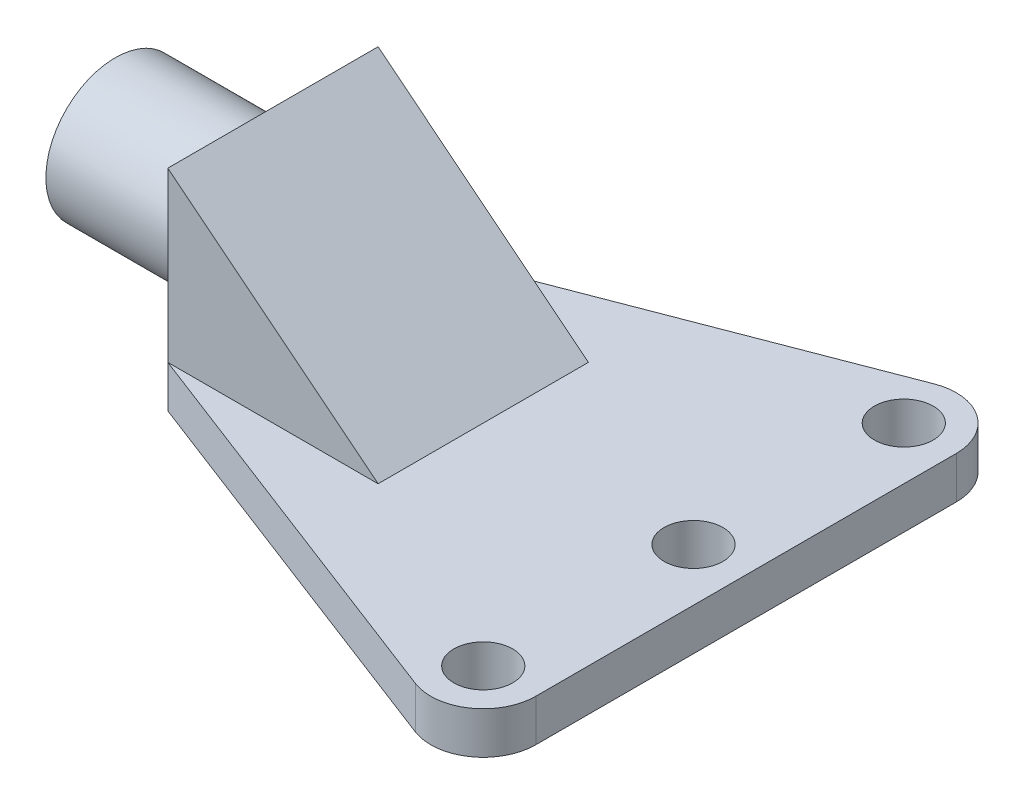
ISO-10303-21;
HEADER;
FILE_DESCRIPTION(('STEP AP214'),'2;1');
FILE_NAME('part.step','',(''),(''),'','','');
FILE_SCHEMA(('AUTOMOTIVE_DESIGN { 1 0 10303 214 1 1 1 1 }'));
ENDSEC;
DATA;
#1=APPLICATION_CONTEXT('core data for automotive mechanical design processes');
#2=APPLICATION_PROTOCOL_DEFINITION('international standard','automotive_design',2000,#1);
#3=PRODUCT_CONTEXT('',#1,'mechanical');
#4=PRODUCT('Part','Part','',(#3));
#5=PRODUCT_RELATED_PRODUCT_CATEGORY('part','',(#4));
#6=PRODUCT_DEFINITION_FORMATION('','',#4);
#7=PRODUCT_DEFINITION_CONTEXT('part definition',#1,'design');
#8=PRODUCT_DEFINITION('design','',#6,#7);
#9=PRODUCT_DEFINITION_SHAPE('','',#8);
#10=(LENGTH_UNIT() NAMED_UNIT(*) SI_UNIT(.MILLI.,.METRE.));
#11=(NAMED_UNIT(*) PLANE_ANGLE_UNIT() SI_UNIT($,.RADIAN.));
#12=(NAMED_UNIT(*) SI_UNIT($,.STERADIAN.) SOLID_ANGLE_UNIT());
#13=UNCERTAINTY_MEASURE_WITH_UNIT(LENGTH_MEASURE(1.E-05),#10,'distance_accuracy_value','');
#14=(GEOMETRIC_REPRESENTATION_CONTEXT(3) GLOBAL_UNCERTAINTY_ASSIGNED_CONTEXT((#13)) GLOBAL_UNIT_ASSIGNED_CONTEXT((#10,
#11,#12)) REPRESENTATION_CONTEXT('',''));
#15=CARTESIAN_POINT('',(0.,0.,0.));
#16=DIRECTION('',(0.,0.,1.));
#17=DIRECTION('',(1.,0.,0.));
#18=AXIS2_PLACEMENT_3D('',#15,#16,#17);
#19=CARTESIAN_POINT('',(0.,5.08,-25.4));
#20=DIRECTION('',(0.,1.,0.));
#21=DIRECTION('',(0.,0.,1.));
#22=AXIS2_PLACEMENT_3D('',#19,#20,#21);
#23=PLANE('',#22);
#24=CARTESIAN_POINT('',(0.,5.08,0.));
#25=DIRECTION('',(0.,1.,0.));
#26=DIRECTION('',(0.,0.,1.));
#27=AXIS2_PLACEMENT_3D('',#24,#25,#26);
#28=CIRCLE('',#27,3.556);
#29=CARTESIAN_POINT('',(0.,5.08,-3.556));
#30=VERTEX_POINT('',#29);
#31=EDGE_CURVE('E205',#30,#30,#28,.T.);
#32=ORIENTED_EDGE('',*,*,#31,.F.);
#33=EDGE_LOOP('',(#32));
#34=FACE_BOUND('',#33,.T.);
#35=CARTESIAN_POINT('',(0.,5.08,-25.4));
#36=DIRECTION('',(0.,1.,0.));
#37=DIRECTION('',(0.,0.,1.));
#38=AXIS2_PLACEMENT_3D('',#35,#36,#37);
#39=CIRCLE('',#38,3.556);
#40=CARTESIAN_POINT('',(0.,5.08,-28.956));
#41=VERTEX_POINT('',#40);
#42=EDGE_CURVE('E143',#41,#41,#39,.T.);
#43=ORIENTED_EDGE('',*,*,#42,.F.);
#44=EDGE_LOOP('',(#43));
#45=FACE_BOUND('',#44,.T.);
#46=CARTESIAN_POINT('',(0.,5.08,25.4));
#47=DIRECTION('',(0.,1.,0.));
#48=DIRECTION('',(0.,0.,1.));
#49=AXIS2_PLACEMENT_3D('',#46,#47,#48);
#50=CIRCLE('',#49,3.556);
#51=CARTESIAN_POINT('',(0.,5.08,21.844));
#52=VERTEX_POINT('',#51);
#53=EDGE_CURVE('E149',#52,#52,#50,.T.);
#54=ORIENTED_EDGE('',*,*,#53,.F.);
#55=EDGE_LOOP('',(#54));
#56=FACE_BOUND('',#55,.T.);
#57=DIRECTION('',(-0.933570914337952,0.,0.35839272858444));
#58=VECTOR('',#57,1.);
#59=CARTESIAN_POINT('',(-50.8,5.08,-12.7));
#60=LINE('',#59,#58);
#61=CARTESIAN_POINT('',(-2.27579382651031,5.08,-31.3281753060437));
#62=VERTEX_POINT('',#61);
#63=CARTESIAN_POINT('',(-50.8,5.08,-12.7));
#64=VERTEX_POINT('',#63);
#65=EDGE_CURVE('E128',#62,#64,#60,.T.);
#66=ORIENTED_EDGE('',*,*,#65,.T.);
#67=DIRECTION('',(1.,0.,0.));
#68=VECTOR('',#67,1.);
#69=CARTESIAN_POINT('',(0.,5.08,-12.7));
#70=LINE('',#69,#68);
#71=CARTESIAN_POINT('',(-25.4,5.08,-12.7));
#72=VERTEX_POINT('',#71);
#73=EDGE_CURVE('E122',#64,#72,#70,.T.);
#74=ORIENTED_EDGE('',*,*,#73,.T.);
#75=DIRECTION('',(0.,0.,-1.));
#76=VECTOR('',#75,1.);
#77=CARTESIAN_POINT('',(-25.4,5.08,31.7507145946854));
#78=LINE('',#77,#76);
#79=CARTESIAN_POINT('',(-25.4,5.08,12.7));
#80=VERTEX_POINT('',#79);
#81=EDGE_CURVE('E110',#80,#72,#78,.T.);
#82=ORIENTED_EDGE('',*,*,#81,.F.);
#83=DIRECTION('',(-1.,0.,0.));
#84=VECTOR('',#83,1.);
#85=CARTESIAN_POINT('',(0.,5.08,12.7));
#86=LINE('',#85,#84);
#87=CARTESIAN_POINT('',(-50.8,5.08,12.7));
#88=VERTEX_POINT('',#87);
#89=EDGE_CURVE('E130',#80,#88,#86,.T.);
#90=ORIENTED_EDGE('',*,*,#89,.T.);
#91=DIRECTION('',(0.933572882255343,0.,0.358387602348981));
#92=VECTOR('',#91,1.);
#93=CARTESIAN_POINT('',(-50.8,5.08,12.7));
#94=LINE('',#93,#92);
#95=CARTESIAN_POINT('',(-2.27565898918961,5.08,31.3279213556592));
#96=VERTEX_POINT('',#95);
#97=EDGE_CURVE('E88',#88,#96,#94,.T.);
#98=ORIENTED_EDGE('',*,*,#97,.T.);
#99=CARTESIAN_POINT('',(0.,5.08,25.4));
#100=DIRECTION('',(0.,1.,0.));
#101=DIRECTION('',(0.,0.,1.));
#102=AXIS2_PLACEMENT_3D('',#99,#100,#101);
#103=CIRCLE('',#102,6.34971459468536);
#104=CARTESIAN_POINT('',(6.34971459468536,5.08,25.4));
#105=VERTEX_POINT('',#104);
#106=EDGE_CURVE('E154',#96,#105,#103,.T.);
#107=ORIENTED_EDGE('',*,*,#106,.T.);
#108=DIRECTION('',(5.61821480663238E-06,0.,-0.999999999984218));
#109=VECTOR('',#108,1.);
#110=CARTESIAN_POINT('',(6.34999999999754,5.08,-25.4));
#111=LINE('',#110,#109);
#112=CARTESIAN_POINT('',(6.34999999999754,5.08,-25.4));
#113=VERTEX_POINT('',#112);
#114=EDGE_CURVE('E156',#105,#113,#111,.T.);
#115=ORIENTED_EDGE('',*,*,#114,.T.);
#116=CARTESIAN_POINT('',(0.,5.08,-25.4));
#117=DIRECTION('',(0.,1.,0.));
#118=DIRECTION('',(0.,0.,1.));
#119=AXIS2_PLACEMENT_3D('',#116,#117,#118);
#120=CIRCLE('',#119,6.34999999999754);
#121=EDGE_CURVE('E51',#113,#62,#120,.T.);
#122=ORIENTED_EDGE('',*,*,#121,.T.);
#123=EDGE_LOOP('',(#66,#74,#82,#90,#98,#107,#115,#122));
#124=FACE_BOUND('',#123,.T.);
#125=ADVANCED_FACE('F34',(#34,#45,#56,#124),#23,.T.);
#126=CARTESIAN_POINT('',(-50.8,5.08,12.7));
#127=DIRECTION('',(1.,0.,0.));
#128=DIRECTION('',(0.,0.,-1.));
#129=AXIS2_PLACEMENT_3D('',#126,#127,#128);
#130=PLANE('',#129);
#131=DIRECTION('',(0.,-1.,0.));
#132=VECTOR('',#131,1.);
#133=CARTESIAN_POINT('',(-50.8,5.08,12.7));
#134=LINE('',#133,#132);
#135=CARTESIAN_POINT('',(-50.8,0.,12.7));
#136=VERTEX_POINT('',#135);
#137=EDGE_CURVE('E11',#88,#136,#134,.T.);
#138=ORIENTED_EDGE('',*,*,#137,.F.);
#139=DIRECTION('',(0.,-1.,0.));
#140=VECTOR('',#139,1.);
#141=CARTESIAN_POINT('',(-50.8,25.4,12.7));
#142=LINE('',#141,#140);
#143=CARTESIAN_POINT('',(-50.8,25.4,12.7));
#144=VERTEX_POINT('',#143);
#145=EDGE_CURVE('E200',#144,#88,#142,.T.);
#146=ORIENTED_EDGE('',*,*,#145,.F.);
#147=DIRECTION('',(0.,0.,1.));
#148=VECTOR('',#147,1.);
#149=CARTESIAN_POINT('',(-50.8,25.4,12.7));
#150=LINE('',#149,#148);
#151=CARTESIAN_POINT('',(-50.8,25.4,-12.7));
#152=VERTEX_POINT('',#151);
#153=EDGE_CURVE('E118',#152,#144,#150,.T.);
#154=ORIENTED_EDGE('',*,*,#153,.F.);
#155=DIRECTION('',(0.,-1.,0.));
#156=VECTOR('',#155,1.);
#157=CARTESIAN_POINT('',(-50.8,25.4,-12.7));
#158=LINE('',#157,#156);
#159=EDGE_CURVE('E124',#152,#64,#158,.T.);
#160=ORIENTED_EDGE('',*,*,#159,.T.);
#161=DIRECTION('',(0.,-1.,0.));
#162=VECTOR('',#161,1.);
#163=CARTESIAN_POINT('',(-50.8,5.08,-12.7));
#164=LINE('',#163,#162);
#165=CARTESIAN_POINT('',(-50.8,0.,-12.7));
#166=VERTEX_POINT('',#165);
#167=EDGE_CURVE('E160',#64,#166,#164,.T.);
#168=ORIENTED_EDGE('',*,*,#167,.T.);
#169=DIRECTION('',(0.,0.,1.));
#170=VECTOR('',#169,1.);
#171=CARTESIAN_POINT('',(-50.8,0.,12.7));
#172=LINE('',#171,#170);
#173=EDGE_CURVE('E152',#166,#136,#172,.T.);
#174=ORIENTED_EDGE('',*,*,#173,.T.);
#175=EDGE_LOOP('',(#138,#146,#154,#160,#168,#174));
#176=FACE_BOUND('',#175,.T.);
#177=CARTESIAN_POINT('',(-50.8,12.7,0.));
#178=DIRECTION('',(-1.,0.,0.));
#179=DIRECTION('',(0.,0.,1.));
#180=AXIS2_PLACEMENT_3D('',#177,#178,#179);
#181=CIRCLE('',#180,8.382);
#182=CARTESIAN_POINT('',(-50.8,12.7,-8.382));
#183=VERTEX_POINT('',#182);
#184=EDGE_CURVE('E129',#183,#183,#181,.T.);
#185=ORIENTED_EDGE('',*,*,#184,.F.);
#186=EDGE_LOOP('',(#185));
#187=FACE_BOUND('',#186,.T.);
#188=ADVANCED_FACE('F36',(#176,#187),#130,.F.);
#189=CARTESIAN_POINT('',(-50.8,5.08,12.7));
#190=DIRECTION('',(0.358387602348981,0.,-0.933572882255343));
#191=DIRECTION('',(-0.933572882255343,0.,-0.358387602348981));
#192=AXIS2_PLACEMENT_3D('',#189,#190,#191);
#193=PLANE('',#192);
#194=DIRECTION('',(0.933572882255343,0.,0.358387602348981));
#195=VECTOR('',#194,1.);
#196=CARTESIAN_POINT('',(-50.8,0.,12.7));
#197=LINE('',#196,#195);
#198=CARTESIAN_POINT('',(-2.27565898918961,0.,31.3279213556592));
#199=VERTEX_POINT('',#198);
#200=EDGE_CURVE('E163',#136,#199,#197,.T.);
#201=ORIENTED_EDGE('',*,*,#200,.T.);
#202=DIRECTION('',(0.,-1.,0.));
#203=VECTOR('',#202,1.);
#204=CARTESIAN_POINT('',(-2.27565898918961,5.08,31.3279213556592));
#205=LINE('',#204,#203);
#206=EDGE_CURVE('E43',#96,#199,#205,.T.);
#207=ORIENTED_EDGE('',*,*,#206,.F.);
#208=ORIENTED_EDGE('',*,*,#97,.F.);
#209=ORIENTED_EDGE('',*,*,#137,.T.);
#210=EDGE_LOOP('',(#201,#207,#208,#209));
#211=FACE_BOUND('',#210,.T.);
#212=ADVANCED_FACE('F228',(#211),#193,.F.);
#213=CARTESIAN_POINT('',(0.,5.08,25.4));
#214=DIRECTION('',(0.,-1.,0.));
#215=DIRECTION('',(0.,0.,-1.));
#216=AXIS2_PLACEMENT_3D('',#213,#214,#215);
#217=CYLINDRICAL_SURFACE('',#216,6.34971459468536);
#218=CARTESIAN_POINT('',(0.,0.,25.4));
#219=DIRECTION('',(0.,1.,0.));
#220=DIRECTION('',(0.,0.,1.));
#221=AXIS2_PLACEMENT_3D('',#218,#219,#220);
#222=CIRCLE('',#221,6.34971459468536);
#223=CARTESIAN_POINT('',(6.34971459468536,0.,25.4));
#224=VERTEX_POINT('',#223);
#225=EDGE_CURVE('E165',#199,#224,#222,.T.);
#226=ORIENTED_EDGE('',*,*,#225,.T.);
#227=DIRECTION('',(0.,-1.,0.));
#228=VECTOR('',#227,1.);
#229=CARTESIAN_POINT('',(6.34971459468536,5.08,25.4));
#230=LINE('',#229,#228);
#231=EDGE_CURVE('E176',#105,#224,#230,.T.);
#232=ORIENTED_EDGE('',*,*,#231,.F.);
#233=ORIENTED_EDGE('',*,*,#106,.F.);
#234=ORIENTED_EDGE('',*,*,#206,.T.);
#235=EDGE_LOOP('',(#226,#232,#233,#234));
#236=FACE_BOUND('',#235,.T.);
#237=ADVANCED_FACE('F182',(#236),#217,.T.);
#238=CARTESIAN_POINT('',(6.34999999999754,5.08,-25.4));
#239=DIRECTION('',(-0.999999999984218,0.,-5.61821480663238E-06));
#240=DIRECTION('',(-5.61821480663238E-06,0.,0.999999999984218));
#241=AXIS2_PLACEMENT_3D('',#238,#239,#240);
#242=PLANE('',#241);
#243=DIRECTION('',(5.61821480663238E-06,0.,-0.999999999984218));
#244=VECTOR('',#243,1.);
#245=CARTESIAN_POINT('',(6.34999999999754,0.,-25.4));
#246=LINE('',#245,#244);
#247=CARTESIAN_POINT('',(6.34999999999754,0.,-25.4));
#248=VERTEX_POINT('',#247);
#249=EDGE_CURVE('E167',#224,#248,#246,.T.);
#250=ORIENTED_EDGE('',*,*,#249,.T.);
#251=DIRECTION('',(0.,-1.,0.));
#252=VECTOR('',#251,1.);
#253=CARTESIAN_POINT('',(6.34999999999754,5.08,-25.4));
#254=LINE('',#253,#252);
#255=EDGE_CURVE('E174',#113,#248,#254,.T.);
#256=ORIENTED_EDGE('',*,*,#255,.F.);
#257=ORIENTED_EDGE('',*,*,#114,.F.);
#258=ORIENTED_EDGE('',*,*,#231,.T.);
#259=EDGE_LOOP('',(#250,#256,#257,#258));
#260=FACE_BOUND('',#259,.T.);
#261=ADVANCED_FACE('F192',(#260),#242,.F.);
#262=CARTESIAN_POINT('',(0.,5.08,-25.4));
#263=DIRECTION('',(0.,-1.,0.));
#264=DIRECTION('',(0.,0.,-1.));
#265=AXIS2_PLACEMENT_3D('',#262,#263,#264);
#266=CYLINDRICAL_SURFACE('',#265,6.34999999999754);
#267=CARTESIAN_POINT('',(0.,0.,-25.4));
#268=DIRECTION('',(0.,1.,0.));
#269=DIRECTION('',(0.,0.,1.));
#270=AXIS2_PLACEMENT_3D('',#267,#268,#269);
#271=CIRCLE('',#270,6.34999999999754);
#272=CARTESIAN_POINT('',(-2.27579382651031,0.,-31.3281753060437));
#273=VERTEX_POINT('',#272);
#274=EDGE_CURVE('E74',#248,#273,#271,.T.);
#275=ORIENTED_EDGE('',*,*,#274,.T.);
#276=DIRECTION('',(0.,-1.,0.));
#277=VECTOR('',#276,1.);
#278=CARTESIAN_POINT('',(-2.27579382651031,5.08,-31.3281753060437));
#279=LINE('',#278,#277);
#280=EDGE_CURVE('E172',#62,#273,#279,.T.);
#281=ORIENTED_EDGE('',*,*,#280,.F.);
#282=ORIENTED_EDGE('',*,*,#121,.F.);
#283=ORIENTED_EDGE('',*,*,#255,.T.);
#284=EDGE_LOOP('',(#275,#281,#282,#283));
#285=FACE_BOUND('',#284,.T.);
#286=ADVANCED_FACE('F194',(#285),#266,.T.);
#287=CARTESIAN_POINT('',(-50.8,5.08,-12.7));
#288=DIRECTION('',(0.35839272858444,0.,0.933570914337952));
#289=DIRECTION('',(0.933570914337952,0.,-0.35839272858444));
#290=AXIS2_PLACEMENT_3D('',#287,#288,#289);
#291=PLANE('',#290);
#292=DIRECTION('',(-0.933570914337952,0.,0.35839272858444));
#293=VECTOR('',#292,1.);
#294=CARTESIAN_POINT('',(-50.8,0.,-12.7));
#295=LINE('',#294,#293);
#296=EDGE_CURVE('E81',#273,#166,#295,.T.);
#297=ORIENTED_EDGE('',*,*,#296,.T.);
#298=ORIENTED_EDGE('',*,*,#167,.F.);
#299=ORIENTED_EDGE('',*,*,#65,.F.);
#300=ORIENTED_EDGE('',*,*,#280,.T.);
#301=EDGE_LOOP('',(#297,#298,#299,#300));
#302=FACE_BOUND('',#301,.T.);
#303=ADVANCED_FACE('F195',(#302),#291,.F.);
#304=CARTESIAN_POINT('',(0.,0.,-25.4));
#305=DIRECTION('',(0.,1.,0.));
#306=DIRECTION('',(0.,0.,1.));
#307=AXIS2_PLACEMENT_3D('',#304,#305,#306);
#308=PLANE('',#307);
#309=CARTESIAN_POINT('',(0.,0.,0.));
#310=DIRECTION('',(0.,1.,0.));
#311=DIRECTION('',(0.,0.,1.));
#312=AXIS2_PLACEMENT_3D('',#309,#310,#311);
#313=CIRCLE('',#312,3.556);
#314=CARTESIAN_POINT('',(0.,0.,-3.556));
#315=VERTEX_POINT('',#314);
#316=EDGE_CURVE('E208',#315,#315,#313,.T.);
#317=ORIENTED_EDGE('',*,*,#316,.T.);
#318=EDGE_LOOP('',(#317));
#319=FACE_BOUND('',#318,.T.);
#320=ORIENTED_EDGE('',*,*,#173,.F.);
#321=ORIENTED_EDGE('',*,*,#296,.F.);
#322=ORIENTED_EDGE('',*,*,#274,.F.);
#323=ORIENTED_EDGE('',*,*,#249,.F.);
#324=ORIENTED_EDGE('',*,*,#225,.F.);
#325=ORIENTED_EDGE('',*,*,#200,.F.);
#326=EDGE_LOOP('',(#320,#321,#322,#323,#324,#325));
#327=FACE_BOUND('',#326,.T.);
#328=CARTESIAN_POINT('',(0.,0.,25.4));
#329=DIRECTION('',(0.,1.,0.));
#330=DIRECTION('',(0.,0.,1.));
#331=AXIS2_PLACEMENT_3D('',#328,#329,#330);
#332=CIRCLE('',#331,3.556);
#333=CARTESIAN_POINT('',(0.,0.,21.844));
#334=VERTEX_POINT('',#333);
#335=EDGE_CURVE('E146',#334,#334,#332,.T.);
#336=ORIENTED_EDGE('',*,*,#335,.T.);
#337=EDGE_LOOP('',(#336));
#338=FACE_BOUND('',#337,.T.);
#339=CARTESIAN_POINT('',(0.,0.,-25.4));
#340=DIRECTION('',(0.,1.,0.));
#341=DIRECTION('',(0.,0.,1.));
#342=AXIS2_PLACEMENT_3D('',#339,#340,#341);
#343=CIRCLE('',#342,3.556);
#344=CARTESIAN_POINT('',(0.,0.,-28.956));
#345=VERTEX_POINT('',#344);
#346=EDGE_CURVE('E139',#345,#345,#343,.T.);
#347=ORIENTED_EDGE('',*,*,#346,.T.);
#348=EDGE_LOOP('',(#347));
#349=FACE_BOUND('',#348,.T.);
#350=ADVANCED_FACE('F188',(#319,#327,#338,#349),#308,.F.);
#351=CARTESIAN_POINT('',(0.,25.401,25.4));
#352=DIRECTION('',(0.,-1.,0.));
#353=DIRECTION('',(0.,0.,-1.));
#354=AXIS2_PLACEMENT_3D('',#351,#352,#353);
#355=CYLINDRICAL_SURFACE('',#354,3.556);
#356=CARTESIAN_POINT('',(0.,5.08,21.844));
#357=CARTESIAN_POINT('',(0.,5.02708333333333,21.844));
#358=CARTESIAN_POINT('',(0.,4.97416666666667,21.844));
#359=CARTESIAN_POINT('',(0.,4.86833333333333,21.844));
#360=CARTESIAN_POINT('',(0.,4.81541666666667,21.844));
#361=CARTESIAN_POINT('',(0.,4.70958333333333,21.844));
#362=CARTESIAN_POINT('',(0.,4.65666666666666,21.844));
#363=CARTESIAN_POINT('',(0.,4.55083333333333,21.844));
#364=CARTESIAN_POINT('',(0.,4.49791666666666,21.844));
#365=CARTESIAN_POINT('',(0.,4.39208333333333,21.844));
#366=CARTESIAN_POINT('',(0.,4.33916666666666,21.844));
#367=CARTESIAN_POINT('',(0.,4.23333333333333,21.844));
#368=CARTESIAN_POINT('',(0.,4.18041666666666,21.844));
#369=CARTESIAN_POINT('',(0.,4.07458333333333,21.844));
#370=CARTESIAN_POINT('',(0.,4.02166666666666,21.844));
#371=CARTESIAN_POINT('',(0.,3.91583333333333,21.844));
#372=CARTESIAN_POINT('',(0.,3.86291666666666,21.844));
#373=CARTESIAN_POINT('',(0.,3.75708333333333,21.844));
#374=CARTESIAN_POINT('',(0.,3.70416666666666,21.844));
#375=CARTESIAN_POINT('',(0.,3.59833333333333,21.844));
#376=CARTESIAN_POINT('',(0.,3.54541666666667,21.844));
#377=CARTESIAN_POINT('',(0.,3.43958333333333,21.844));
#378=CARTESIAN_POINT('',(0.,3.38666666666666,21.844));
#379=CARTESIAN_POINT('',(0.,3.28083333333333,21.844));
#380=CARTESIAN_POINT('',(0.,3.22791666666666,21.844));
#381=CARTESIAN_POINT('',(0.,3.12208333333333,21.844));
#382=CARTESIAN_POINT('',(0.,3.06916666666666,21.844));
#383=CARTESIAN_POINT('',(0.,2.96333333333333,21.844));
#384=CARTESIAN_POINT('',(0.,2.91041666666666,21.844));
#385=CARTESIAN_POINT('',(0.,2.80458333333333,21.844));
#386=CARTESIAN_POINT('',(0.,2.75166666666666,21.844));
#387=CARTESIAN_POINT('',(0.,2.64583333333333,21.844));
#388=CARTESIAN_POINT('',(0.,2.59291666666666,21.844));
#389=CARTESIAN_POINT('',(0.,2.48708333333333,21.844));
#390=CARTESIAN_POINT('',(0.,2.43416666666666,21.844));
#391=CARTESIAN_POINT('',(0.,2.32833333333333,21.844));
#392=CARTESIAN_POINT('',(0.,2.27541666666667,21.844));
#393=CARTESIAN_POINT('',(0.,2.16958333333333,21.844));
#394=CARTESIAN_POINT('',(0.,2.11666666666666,21.844));
#395=CARTESIAN_POINT('',(0.,2.01083333333333,21.844));
#396=CARTESIAN_POINT('',(0.,1.95791666666666,21.844));
#397=CARTESIAN_POINT('',(0.,1.85208333333333,21.844));
#398=CARTESIAN_POINT('',(0.,1.79916666666666,21.844));
#399=CARTESIAN_POINT('',(0.,1.69333333333333,21.844));
#400=CARTESIAN_POINT('',(0.,1.64041666666666,21.844));
#401=CARTESIAN_POINT('',(0.,1.53458333333333,21.844));
#402=CARTESIAN_POINT('',(0.,1.48166666666666,21.844));
#403=CARTESIAN_POINT('',(0.,1.37583333333333,21.844));
#404=CARTESIAN_POINT('',(0.,1.32291666666666,21.844));
#405=CARTESIAN_POINT('',(0.,1.21708333333333,21.844));
#406=CARTESIAN_POINT('',(0.,1.16416666666666,21.844));
#407=CARTESIAN_POINT('',(0.,1.05833333333333,21.844));
#408=CARTESIAN_POINT('',(0.,1.00541666666666,21.844));
#409=CARTESIAN_POINT('',(0.,0.899583333333331,21.844));
#410=CARTESIAN_POINT('',(0.,0.846666666666663,21.844));
#411=CARTESIAN_POINT('',(0.,0.740833333333329,21.844));
#412=CARTESIAN_POINT('',(0.,0.687916666666663,21.844));
#413=CARTESIAN_POINT('',(0.,0.58208333333333,21.844));
#414=CARTESIAN_POINT('',(0.,0.529166666666664,21.844));
#415=CARTESIAN_POINT('',(0.,0.42333333333333,21.844));
#416=CARTESIAN_POINT('',(0.,0.370416666666662,21.844));
#417=CARTESIAN_POINT('',(0.,0.264583333333329,21.844));
#418=CARTESIAN_POINT('',(0.,0.211666666666662,21.844));
#419=CARTESIAN_POINT('',(0.,0.105833333333329,21.844));
#420=CARTESIAN_POINT('',(0.,0.0529166666666629,21.844));
#421=CARTESIAN_POINT('',(0.,0.,21.844));
#422=B_SPLINE_CURVE_WITH_KNOTS('',3,(#356,#357,#358,#359,#360,#361,#362,#363,#364,#365,#366,
#367,#368,#369,#370,#371,#372,#373,#374,#375,#376,#377,#378,#379,#380,#381,#382,#383,#384,#385,
#386,#387,#388,#389,#390,#391,#392,#393,#394,#395,#396,#397,#398,#399,#400,#401,#402,#403,#404,
#405,#406,#407,#408,#409,#410,#411,#412,#413,#414,#415,#416,#417,#418,#419,#420,#421),
.UNSPECIFIED.,.F.,.F.,(4,2,2,2,2,2,2,2,2,2,2,2,2,2,2,2,2,2,2,2,2,2,2,2,2,2,2,2,2,2,2,2,4),(0.,
0.158749999999999,0.317499999999998,0.476250000000001,0.635,0.793749999999999,0.952500000000002,
1.11125,1.27,1.42875,1.5875,1.74625,1.905,2.06375,2.2225,2.38125,2.54,2.69875,2.8575,3.01625,
3.175,3.33375,3.4925,3.65125,3.81,3.96875,4.1275,4.28625,4.445,4.60375,4.7625,4.92125,5.08),.UNSPECIFIED.);
#423=EDGE_CURVE('BSEAM233',#52,#334,#422,.T.);
#424=ORIENTED_EDGE('',*,*,#53,.T.);
#425=ORIENTED_EDGE('',*,*,#335,.F.);
#426=ORIENTED_EDGE('',*,*,#423,.T.);
#427=ORIENTED_EDGE('',*,*,#423,.F.);
#428=EDGE_LOOP('',(#424,#426,#425,#427));
#429=FACE_BOUND('',#428,.T.);
#430=ADVANCED_FACE('F233',(#429),#355,.F.);
#431=CARTESIAN_POINT('',(0.,25.401,-25.4));
#432=DIRECTION('',(0.,-1.,0.));
#433=DIRECTION('',(0.,0.,-1.));
#434=AXIS2_PLACEMENT_3D('',#431,#432,#433);
#435=CYLINDRICAL_SURFACE('',#434,3.556);
#436=CARTESIAN_POINT('',(0.,5.08,-28.956));
#437=CARTESIAN_POINT('',(0.,5.02708333333333,-28.956));
#438=CARTESIAN_POINT('',(0.,4.97416666666667,-28.956));
#439=CARTESIAN_POINT('',(0.,4.86833333333333,-28.956));
#440=CARTESIAN_POINT('',(0.,4.81541666666667,-28.956));
#441=CARTESIAN_POINT('',(0.,4.70958333333333,-28.956));
#442=CARTESIAN_POINT('',(0.,4.65666666666666,-28.956));
#443=CARTESIAN_POINT('',(0.,4.55083333333333,-28.956));
#444=CARTESIAN_POINT('',(0.,4.49791666666666,-28.956));
#445=CARTESIAN_POINT('',(0.,4.39208333333333,-28.956));
#446=CARTESIAN_POINT('',(0.,4.33916666666666,-28.956));
#447=CARTESIAN_POINT('',(0.,4.23333333333333,-28.956));
#448=CARTESIAN_POINT('',(0.,4.18041666666666,-28.956));
#449=CARTESIAN_POINT('',(0.,4.07458333333333,-28.956));
#450=CARTESIAN_POINT('',(0.,4.02166666666666,-28.956));
#451=CARTESIAN_POINT('',(0.,3.91583333333333,-28.956));
#452=CARTESIAN_POINT('',(0.,3.86291666666666,-28.956));
#453=CARTESIAN_POINT('',(0.,3.75708333333333,-28.956));
#454=CARTESIAN_POINT('',(0.,3.70416666666666,-28.956));
#455=CARTESIAN_POINT('',(0.,3.59833333333333,-28.956));
#456=CARTESIAN_POINT('',(0.,3.54541666666667,-28.956));
#457=CARTESIAN_POINT('',(0.,3.43958333333333,-28.956));
#458=CARTESIAN_POINT('',(0.,3.38666666666666,-28.956));
#459=CARTESIAN_POINT('',(0.,3.28083333333333,-28.956));
#460=CARTESIAN_POINT('',(0.,3.22791666666666,-28.956));
#461=CARTESIAN_POINT('',(0.,3.12208333333333,-28.956));
#462=CARTESIAN_POINT('',(0.,3.06916666666666,-28.956));
#463=CARTESIAN_POINT('',(0.,2.96333333333333,-28.956));
#464=CARTESIAN_POINT('',(0.,2.91041666666666,-28.956));
#465=CARTESIAN_POINT('',(0.,2.80458333333333,-28.956));
#466=CARTESIAN_POINT('',(0.,2.75166666666666,-28.956));
#467=CARTESIAN_POINT('',(0.,2.64583333333333,-28.956));
#468=CARTESIAN_POINT('',(0.,2.59291666666666,-28.956));
#469=CARTESIAN_POINT('',(0.,2.48708333333333,-28.956));
#470=CARTESIAN_POINT('',(0.,2.43416666666666,-28.956));
#471=CARTESIAN_POINT('',(0.,2.32833333333333,-28.956));
#472=CARTESIAN_POINT('',(0.,2.27541666666667,-28.956));
#473=CARTESIAN_POINT('',(0.,2.16958333333333,-28.956));
#474=CARTESIAN_POINT('',(0.,2.11666666666666,-28.956));
#475=CARTESIAN_POINT('',(0.,2.01083333333333,-28.956));
#476=CARTESIAN_POINT('',(0.,1.95791666666666,-28.956));
#477=CARTESIAN_POINT('',(0.,1.85208333333333,-28.956));
#478=CARTESIAN_POINT('',(0.,1.79916666666666,-28.956));
#479=CARTESIAN_POINT('',(0.,1.69333333333333,-28.956));
#480=CARTESIAN_POINT('',(0.,1.64041666666666,-28.956));
#481=CARTESIAN_POINT('',(0.,1.53458333333333,-28.956));
#482=CARTESIAN_POINT('',(0.,1.48166666666666,-28.956));
#483=CARTESIAN_POINT('',(0.,1.37583333333333,-28.956));
#484=CARTESIAN_POINT('',(0.,1.32291666666666,-28.956));
#485=CARTESIAN_POINT('',(0.,1.21708333333333,-28.956));
#486=CARTESIAN_POINT('',(0.,1.16416666666666,-28.956));
#487=CARTESIAN_POINT('',(0.,1.05833333333333,-28.956));
#488=CARTESIAN_POINT('',(0.,1.00541666666666,-28.956));
#489=CARTESIAN_POINT('',(0.,0.899583333333331,-28.956));
#490=CARTESIAN_POINT('',(0.,0.846666666666663,-28.956));
#491=CARTESIAN_POINT('',(0.,0.740833333333329,-28.956));
#492=CARTESIAN_POINT('',(0.,0.687916666666663,-28.956));
#493=CARTESIAN_POINT('',(0.,0.58208333333333,-28.956));
#494=CARTESIAN_POINT('',(0.,0.529166666666664,-28.956));
#495=CARTESIAN_POINT('',(0.,0.42333333333333,-28.956));
#496=CARTESIAN_POINT('',(0.,0.370416666666662,-28.956));
#497=CARTESIAN_POINT('',(0.,0.264583333333329,-28.956));
#498=CARTESIAN_POINT('',(0.,0.211666666666662,-28.956));
#499=CARTESIAN_POINT('',(0.,0.105833333333329,-28.956));
#500=CARTESIAN_POINT('',(0.,0.0529166666666629,-28.956));
#501=CARTESIAN_POINT('',(0.,0.,-28.956));
#502=B_SPLINE_CURVE_WITH_KNOTS('',3,(#436,#437,#438,#439,#440,#441,#442,#443,#444,#445,#446,
#447,#448,#449,#450,#451,#452,#453,#454,#455,#456,#457,#458,#459,#460,#461,#462,#463,#464,#465,
#466,#467,#468,#469,#470,#471,#472,#473,#474,#475,#476,#477,#478,#479,#480,#481,#482,#483,#484,
#485,#486,#487,#488,#489,#490,#491,#492,#493,#494,#495,#496,#497,#498,#499,#500,#501),
.UNSPECIFIED.,.F.,.F.,(4,2,2,2,2,2,2,2,2,2,2,2,2,2,2,2,2,2,2,2,2,2,2,2,2,2,2,2,2,2,2,2,4),(0.,
0.158749999999999,0.317499999999998,0.476250000000001,0.635,0.793749999999999,0.952500000000002,
1.11125,1.27,1.42875,1.5875,1.74625,1.905,2.06375,2.2225,2.38125,2.54,2.69875,2.8575,3.01625,
3.175,3.33375,3.4925,3.65125,3.81,3.96875,4.1275,4.28625,4.445,4.60375,4.7625,4.92125,5.08),.UNSPECIFIED.);
#503=EDGE_CURVE('BSEAM261',#41,#345,#502,.T.);
#504=ORIENTED_EDGE('',*,*,#42,.T.);
#505=ORIENTED_EDGE('',*,*,#346,.F.);
#506=ORIENTED_EDGE('',*,*,#503,.T.);
#507=ORIENTED_EDGE('',*,*,#503,.F.);
#508=EDGE_LOOP('',(#504,#506,#505,#507));
#509=FACE_BOUND('',#508,.T.);
#510=ADVANCED_FACE('F261',(#509),#435,.F.);
#511=CARTESIAN_POINT('',(-69.85,12.7,0.));
#512=DIRECTION('',(1.,0.,0.));
#513=DIRECTION('',(0.,0.,-1.));
#514=AXIS2_PLACEMENT_3D('',#511,#512,#513);
#515=CYLINDRICAL_SURFACE('',#514,8.382);
#516=CARTESIAN_POINT('',(-69.85,12.7,0.));
#517=DIRECTION('',(-1.,0.,0.));
#518=DIRECTION('',(0.,0.,1.));
#519=AXIS2_PLACEMENT_3D('',#516,#517,#518);
#520=CIRCLE('',#519,8.382);
#521=CARTESIAN_POINT('',(-69.85,12.7,-8.382));
#522=VERTEX_POINT('',#521);
#523=EDGE_CURVE('E133',#522,#522,#520,.T.);
#524=CARTESIAN_POINT('',(-69.85,12.7,-8.382));
#525=CARTESIAN_POINT('',(-69.6515625,12.7,-8.382));
#526=CARTESIAN_POINT('',(-69.453125,12.7,-8.382));
#527=CARTESIAN_POINT('',(-69.05625,12.7,-8.382));
#528=CARTESIAN_POINT('',(-68.8578125,12.7,-8.382));
#529=CARTESIAN_POINT('',(-68.4609375,12.7,-8.382));
#530=CARTESIAN_POINT('',(-68.2625,12.7,-8.382));
#531=CARTESIAN_POINT('',(-67.865625,12.7,-8.382));
#532=CARTESIAN_POINT('',(-67.6671875,12.7,-8.382));
#533=CARTESIAN_POINT('',(-67.2703125,12.7,-8.382));
#534=CARTESIAN_POINT('',(-67.071875,12.7,-8.382));
#535=CARTESIAN_POINT('',(-66.675,12.7,-8.382));
#536=CARTESIAN_POINT('',(-66.4765625,12.7,-8.382));
#537=CARTESIAN_POINT('',(-66.0796875,12.7,-8.382));
#538=CARTESIAN_POINT('',(-65.88125,12.7,-8.382));
#539=CARTESIAN_POINT('',(-65.484375,12.7,-8.382));
#540=CARTESIAN_POINT('',(-65.2859375,12.7,-8.382));
#541=CARTESIAN_POINT('',(-64.8890625,12.7,-8.382));
#542=CARTESIAN_POINT('',(-64.690625,12.7,-8.382));
#543=CARTESIAN_POINT('',(-64.29375,12.7,-8.382));
#544=CARTESIAN_POINT('',(-64.0953125,12.7,-8.382));
#545=CARTESIAN_POINT('',(-63.6984375,12.7,-8.382));
#546=CARTESIAN_POINT('',(-63.5,12.7,-8.382));
#547=CARTESIAN_POINT('',(-63.103125,12.7,-8.382));
#548=CARTESIAN_POINT('',(-62.9046875,12.7,-8.382));
#549=CARTESIAN_POINT('',(-62.5078125,12.7,-8.382));
#550=CARTESIAN_POINT('',(-62.309375,12.7,-8.382));
#551=CARTESIAN_POINT('',(-61.9125,12.7,-8.382));
#552=CARTESIAN_POINT('',(-61.7140625,12.7,-8.382));
#553=CARTESIAN_POINT('',(-61.3171875,12.7,-8.382));
#554=CARTESIAN_POINT('',(-61.11875,12.7,-8.382));
#555=CARTESIAN_POINT('',(-60.721875,12.7,-8.382));
#556=CARTESIAN_POINT('',(-60.5234375,12.7,-8.382));
#557=CARTESIAN_POINT('',(-60.1265625,12.7,-8.382));
#558=CARTESIAN_POINT('',(-59.928125,12.7,-8.382));
#559=CARTESIAN_POINT('',(-59.53125,12.7,-8.382));
#560=CARTESIAN_POINT('',(-59.3328125,12.7,-8.382));
#561=CARTESIAN_POINT('',(-58.9359375,12.7,-8.382));
#562=CARTESIAN_POINT('',(-58.7375,12.7,-8.382));
#563=CARTESIAN_POINT('',(-58.340625,12.7,-8.382));
#564=CARTESIAN_POINT('',(-58.1421875,12.7,-8.382));
#565=CARTESIAN_POINT('',(-57.7453125,12.7,-8.382));
#566=CARTESIAN_POINT('',(-57.546875,12.7,-8.382));
#567=CARTESIAN_POINT('',(-57.15,12.7,-8.382));
#568=CARTESIAN_POINT('',(-56.9515625,12.7,-8.382));
#569=CARTESIAN_POINT('',(-56.5546875,12.7,-8.382));
#570=CARTESIAN_POINT('',(-56.35625,12.7,-8.382));
#571=CARTESIAN_POINT('',(-55.959375,12.7,-8.382));
#572=CARTESIAN_POINT('',(-55.7609375,12.7,-8.382));
#573=CARTESIAN_POINT('',(-55.3640625,12.7,-8.382));
#574=CARTESIAN_POINT('',(-55.165625,12.7,-8.382));
#575=CARTESIAN_POINT('',(-54.76875,12.7,-8.382));
#576=CARTESIAN_POINT('',(-54.5703125,12.7,-8.382));
#577=CARTESIAN_POINT('',(-54.1734375,12.7,-8.382));
#578=CARTESIAN_POINT('',(-53.975,12.7,-8.382));
#579=CARTESIAN_POINT('',(-53.578125,12.7,-8.382));
#580=CARTESIAN_POINT('',(-53.3796875,12.7,-8.382));
#581=CARTESIAN_POINT('',(-52.9828125,12.7,-8.382));
#582=CARTESIAN_POINT('',(-52.784375,12.7,-8.382));
#583=CARTESIAN_POINT('',(-52.3875,12.7,-8.382));
#584=CARTESIAN_POINT('',(-52.1890625,12.7,-8.382));
#585=CARTESIAN_POINT('',(-51.7921875,12.7,-8.382));
#586=CARTESIAN_POINT('',(-51.59375,12.7,-8.382));
#587=CARTESIAN_POINT('',(-51.196875,12.7,-8.382));
#588=CARTESIAN_POINT('',(-50.9984375,12.7,-8.382));
#589=CARTESIAN_POINT('',(-50.8,12.7,-8.382));
#590=B_SPLINE_CURVE_WITH_KNOTS('',3,(#524,#525,#526,#527,#528,#529,#530,#531,#532,#533,#534,
#535,#536,#537,#538,#539,#540,#541,#542,#543,#544,#545,#546,#547,#548,#549,#550,#551,#552,#553,
#554,#555,#556,#557,#558,#559,#560,#561,#562,#563,#564,#565,#566,#567,#568,#569,#570,#571,#572,
#573,#574,#575,#576,#577,#578,#579,#580,#581,#582,#583,#584,#585,#586,#587,#588,#589),
.UNSPECIFIED.,.F.,.F.,(4,2,2,2,2,2,2,2,2,2,2,2,2,2,2,2,2,2,2,2,2,2,2,2,2,2,2,2,2,2,2,2,4),(0.,
0.5953125,1.190625,1.7859375,2.38125,2.9765625,3.571875,4.1671875,4.7625,5.3578125,5.953125,
6.5484375,7.14375,7.7390625,8.334375,8.92968750000001,9.52500000000001,10.1203125,10.715625,
11.3109375,11.90625,12.5015625,13.096875,13.6921875,14.2875,14.8828125,15.478125,16.0734375,
16.66875,17.2640625,17.859375,18.4546875,19.05),.UNSPECIFIED.);
#591=EDGE_CURVE('BSEAM258',#522,#183,#590,.T.);
#592=ORIENTED_EDGE('',*,*,#523,.F.);
#593=ORIENTED_EDGE('',*,*,#184,.T.);
#594=ORIENTED_EDGE('',*,*,#591,.T.);
#595=ORIENTED_EDGE('',*,*,#591,.F.);
#596=EDGE_LOOP('',(#592,#594,#593,#595));
#597=FACE_BOUND('',#596,.T.);
#598=ADVANCED_FACE('F258',(#597),#515,.T.);
#599=CARTESIAN_POINT('',(-69.85,12.7,0.));
#600=DIRECTION('',(-1.,0.,0.));
#601=DIRECTION('',(0.,0.,1.));
#602=AXIS2_PLACEMENT_3D('',#599,#600,#601);
#603=PLANE('',#602);
#604=ORIENTED_EDGE('',*,*,#523,.T.);
#605=EDGE_LOOP('',(#604));
#606=FACE_BOUND('',#605,.T.);
#607=ADVANCED_FACE('F253',(#606),#603,.T.);
#608=CARTESIAN_POINT('',(-50.8,25.4,-12.7));
#609=DIRECTION('',(0.,0.,1.));
#610=DIRECTION('',(1.,0.,0.));
#611=AXIS2_PLACEMENT_3D('',#608,#609,#610);
#612=PLANE('',#611);
#613=ORIENTED_EDGE('',*,*,#73,.F.);
#614=ORIENTED_EDGE('',*,*,#159,.F.);
#615=DIRECTION('',(-0.78086880944303,0.624695047554424,0.));
#616=VECTOR('',#615,1.);
#617=CARTESIAN_POINT('',(-50.8,25.4,-12.7));
#618=LINE('',#617,#616);
#619=EDGE_CURVE('E113',#72,#152,#618,.T.);
#620=ORIENTED_EDGE('',*,*,#619,.F.);
#621=EDGE_LOOP('',(#613,#614,#620));
#622=FACE_BOUND('',#621,.T.);
#623=ADVANCED_FACE('F121',(#622),#612,.F.);
#624=CARTESIAN_POINT('',(-50.8,25.4,12.7));
#625=DIRECTION('',(0.,0.,-1.));
#626=DIRECTION('',(-1.,0.,0.));
#627=AXIS2_PLACEMENT_3D('',#624,#625,#626);
#628=PLANE('',#627);
#629=ORIENTED_EDGE('',*,*,#89,.F.);
#630=DIRECTION('',(0.78086880944303,-0.624695047554424,0.));
#631=VECTOR('',#630,1.);
#632=CARTESIAN_POINT('',(-50.8,25.4,12.7));
#633=LINE('',#632,#631);
#634=EDGE_CURVE('E116',#144,#80,#633,.T.);
#635=ORIENTED_EDGE('',*,*,#634,.F.);
#636=ORIENTED_EDGE('',*,*,#145,.T.);
#637=EDGE_LOOP('',(#629,#635,#636));
#638=FACE_BOUND('',#637,.T.);
#639=ADVANCED_FACE('F220',(#638),#628,.F.);
#640=CARTESIAN_POINT('',(-50.8,25.4,31.7507145946854));
#641=DIRECTION('',(-0.624695047554424,-0.78086880944303,0.));
#642=DIRECTION('',(0.78086880944303,-0.624695047554424,0.));
#643=AXIS2_PLACEMENT_3D('',#640,#641,#642);
#644=PLANE('',#643);
#645=ORIENTED_EDGE('',*,*,#634,.T.);
#646=ORIENTED_EDGE('',*,*,#81,.T.);
#647=ORIENTED_EDGE('',*,*,#619,.T.);
#648=ORIENTED_EDGE('',*,*,#153,.T.);
#649=EDGE_LOOP('',(#645,#646,#647,#648));
#650=FACE_BOUND('',#649,.T.);
#651=ADVANCED_FACE('F112',(#650),#644,.F.);
#652=CARTESIAN_POINT('',(0.,25.401,0.));
#653=DIRECTION('',(0.,-1.,0.));
#654=DIRECTION('',(0.,0.,-1.));
#655=AXIS2_PLACEMENT_3D('',#652,#653,#654);
#656=CYLINDRICAL_SURFACE('',#655,3.556);
#657=CARTESIAN_POINT('',(0.,5.08,-3.556));
#658=CARTESIAN_POINT('',(0.,5.02708333333333,-3.556));
#659=CARTESIAN_POINT('',(0.,4.97416666666667,-3.556));
#660=CARTESIAN_POINT('',(0.,4.86833333333333,-3.556));
#661=CARTESIAN_POINT('',(0.,4.81541666666667,-3.556));
#662=CARTESIAN_POINT('',(0.,4.70958333333333,-3.556));
#663=CARTESIAN_POINT('',(0.,4.65666666666666,-3.556));
#664=CARTESIAN_POINT('',(0.,4.55083333333333,-3.556));
#665=CARTESIAN_POINT('',(0.,4.49791666666666,-3.556));
#666=CARTESIAN_POINT('',(0.,4.39208333333333,-3.556));
#667=CARTESIAN_POINT('',(0.,4.33916666666666,-3.556));
#668=CARTESIAN_POINT('',(0.,4.23333333333333,-3.556));
#669=CARTESIAN_POINT('',(0.,4.18041666666666,-3.556));
#670=CARTESIAN_POINT('',(0.,4.07458333333333,-3.556));
#671=CARTESIAN_POINT('',(0.,4.02166666666666,-3.556));
#672=CARTESIAN_POINT('',(0.,3.91583333333333,-3.556));
#673=CARTESIAN_POINT('',(0.,3.86291666666666,-3.556));
#674=CARTESIAN_POINT('',(0.,3.75708333333333,-3.556));
#675=CARTESIAN_POINT('',(0.,3.70416666666666,-3.556));
#676=CARTESIAN_POINT('',(0.,3.59833333333333,-3.556));
#677=CARTESIAN_POINT('',(0.,3.54541666666667,-3.556));
#678=CARTESIAN_POINT('',(0.,3.43958333333333,-3.556));
#679=CARTESIAN_POINT('',(0.,3.38666666666666,-3.556));
#680=CARTESIAN_POINT('',(0.,3.28083333333333,-3.556));
#681=CARTESIAN_POINT('',(0.,3.22791666666666,-3.556));
#682=CARTESIAN_POINT('',(0.,3.12208333333333,-3.556));
#683=CARTESIAN_POINT('',(0.,3.06916666666666,-3.556));
#684=CARTESIAN_POINT('',(0.,2.96333333333333,-3.556));
#685=CARTESIAN_POINT('',(0.,2.91041666666666,-3.556));
#686=CARTESIAN_POINT('',(0.,2.80458333333333,-3.556));
#687=CARTESIAN_POINT('',(0.,2.75166666666666,-3.556));
#688=CARTESIAN_POINT('',(0.,2.64583333333333,-3.556));
#689=CARTESIAN_POINT('',(0.,2.59291666666666,-3.556));
#690=CARTESIAN_POINT('',(0.,2.48708333333333,-3.556));
#691=CARTESIAN_POINT('',(0.,2.43416666666666,-3.556));
#692=CARTESIAN_POINT('',(0.,2.32833333333333,-3.556));
#693=CARTESIAN_POINT('',(0.,2.27541666666667,-3.556));
#694=CARTESIAN_POINT('',(0.,2.16958333333333,-3.556));
#695=CARTESIAN_POINT('',(0.,2.11666666666666,-3.556));
#696=CARTESIAN_POINT('',(0.,2.01083333333333,-3.556));
#697=CARTESIAN_POINT('',(0.,1.95791666666666,-3.556));
#698=CARTESIAN_POINT('',(0.,1.85208333333333,-3.556));
#699=CARTESIAN_POINT('',(0.,1.79916666666666,-3.556));
#700=CARTESIAN_POINT('',(0.,1.69333333333333,-3.556));
#701=CARTESIAN_POINT('',(0.,1.64041666666666,-3.556));
#702=CARTESIAN_POINT('',(0.,1.53458333333333,-3.556));
#703=CARTESIAN_POINT('',(0.,1.48166666666666,-3.556));
#704=CARTESIAN_POINT('',(0.,1.37583333333333,-3.556));
#705=CARTESIAN_POINT('',(0.,1.32291666666666,-3.556));
#706=CARTESIAN_POINT('',(0.,1.21708333333333,-3.556));
#707=CARTESIAN_POINT('',(0.,1.16416666666666,-3.556));
#708=CARTESIAN_POINT('',(0.,1.05833333333333,-3.556));
#709=CARTESIAN_POINT('',(0.,1.00541666666666,-3.556));
#710=CARTESIAN_POINT('',(0.,0.899583333333331,-3.556));
#711=CARTESIAN_POINT('',(0.,0.846666666666663,-3.556));
#712=CARTESIAN_POINT('',(0.,0.740833333333329,-3.556));
#713=CARTESIAN_POINT('',(0.,0.687916666666663,-3.556));
#714=CARTESIAN_POINT('',(0.,0.58208333333333,-3.556));
#715=CARTESIAN_POINT('',(0.,0.529166666666664,-3.556));
#716=CARTESIAN_POINT('',(0.,0.42333333333333,-3.556));
#717=CARTESIAN_POINT('',(0.,0.370416666666662,-3.556));
#718=CARTESIAN_POINT('',(0.,0.264583333333329,-3.556));
#719=CARTESIAN_POINT('',(0.,0.211666666666662,-3.556));
#720=CARTESIAN_POINT('',(0.,0.105833333333329,-3.556));
#721=CARTESIAN_POINT('',(0.,0.0529166666666629,-3.556));
#722=CARTESIAN_POINT('',(0.,0.,-3.556));
#723=B_SPLINE_CURVE_WITH_KNOTS('',3,(#657,#658,#659,#660,#661,#662,#663,#664,#665,#666,#667,
#668,#669,#670,#671,#672,#673,#674,#675,#676,#677,#678,#679,#680,#681,#682,#683,#684,#685,#686,
#687,#688,#689,#690,#691,#692,#693,#694,#695,#696,#697,#698,#699,#700,#701,#702,#703,#704,#705,
#706,#707,#708,#709,#710,#711,#712,#713,#714,#715,#716,#717,#718,#719,#720,#721,#722),
.UNSPECIFIED.,.F.,.F.,(4,2,2,2,2,2,2,2,2,2,2,2,2,2,2,2,2,2,2,2,2,2,2,2,2,2,2,2,2,2,2,2,4),(0.,
0.158749999999999,0.317499999999998,0.476250000000001,0.635,0.793749999999999,0.952500000000002,
1.11125,1.27,1.42875,1.5875,1.74625,1.905,2.06375,2.2225,2.38125,2.54,2.69875,2.8575,3.01625,
3.175,3.33375,3.4925,3.65125,3.81,3.96875,4.1275,4.28625,4.445,4.60375,4.7625,4.92125,5.08),.UNSPECIFIED.);
#724=EDGE_CURVE('BSEAM213',#30,#315,#723,.T.);
#725=ORIENTED_EDGE('',*,*,#31,.T.);
#726=ORIENTED_EDGE('',*,*,#316,.F.);
#727=ORIENTED_EDGE('',*,*,#724,.T.);
#728=ORIENTED_EDGE('',*,*,#724,.F.);
#729=EDGE_LOOP('',(#725,#727,#726,#728));
#730=FACE_BOUND('',#729,.T.);
#731=ADVANCED_FACE('F213',(#730),#656,.F.);
#732=CLOSED_SHELL('',(#125,#188,#212,#237,#261,#286,#303,#350,#430,#510,#598,#607,#623,#639,
#651,#731));
#733=MANIFOLD_SOLID_BREP('B2',#732);
#734=ADVANCED_BREP_SHAPE_REPRESENTATION('',(#18,#733),#14);
#735=SHAPE_DEFINITION_REPRESENTATION(#9,#734);
ENDSEC;
END-ISO-10303-21;
